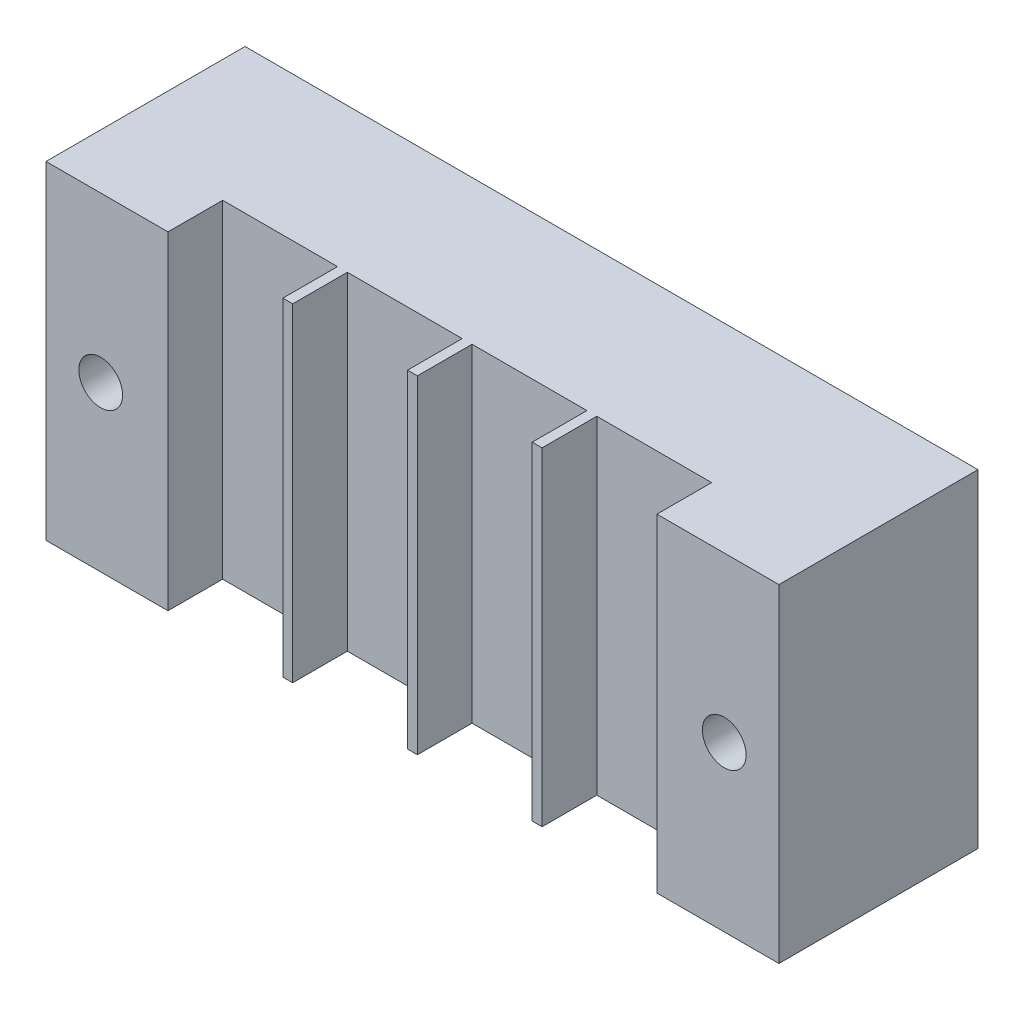
ISO-10303-21;
HEADER;
FILE_DESCRIPTION(('STEP AP214'),'2;1');
FILE_NAME('part.step','',(''),(''),'','','');
FILE_SCHEMA(('AUTOMOTIVE_DESIGN { 1 0 10303 214 1 1 1 1 }'));
ENDSEC;
DATA;
#1=APPLICATION_CONTEXT('core data for automotive mechanical design processes');
#2=APPLICATION_PROTOCOL_DEFINITION('international standard','automotive_design',2000,#1);
#3=PRODUCT_CONTEXT('',#1,'mechanical');
#4=PRODUCT('Part','Part','',(#3));
#5=PRODUCT_RELATED_PRODUCT_CATEGORY('part','',(#4));
#6=PRODUCT_DEFINITION_FORMATION('','',#4);
#7=PRODUCT_DEFINITION_CONTEXT('part definition',#1,'design');
#8=PRODUCT_DEFINITION('design','',#6,#7);
#9=PRODUCT_DEFINITION_SHAPE('','',#8);
#10=(LENGTH_UNIT() NAMED_UNIT(*) SI_UNIT(.MILLI.,.METRE.));
#11=(NAMED_UNIT(*) PLANE_ANGLE_UNIT() SI_UNIT($,.RADIAN.));
#12=(NAMED_UNIT(*) SI_UNIT($,.STERADIAN.) SOLID_ANGLE_UNIT());
#13=UNCERTAINTY_MEASURE_WITH_UNIT(LENGTH_MEASURE(1.E-05),#10,'distance_accuracy_value','');
#14=(GEOMETRIC_REPRESENTATION_CONTEXT(3) GLOBAL_UNCERTAINTY_ASSIGNED_CONTEXT((#13)) GLOBAL_UNIT_ASSIGNED_CONTEXT((#10,
#11,#12)) REPRESENTATION_CONTEXT('',''));
#15=CARTESIAN_POINT('',(0.,0.,0.));
#16=DIRECTION('',(0.,0.,1.));
#17=DIRECTION('',(1.,0.,0.));
#18=AXIS2_PLACEMENT_3D('',#15,#16,#17);
#19=CARTESIAN_POINT('',(0.,0.,18.2));
#20=DIRECTION('',(0.,0.,1.));
#21=DIRECTION('',(1.,0.,0.));
#22=AXIS2_PLACEMENT_3D('',#19,#20,#21);
#23=PLANE('',#22);
#24=DIRECTION('',(0.,1.,0.));
#25=VECTOR('',#24,1.);
#26=CARTESIAN_POINT('',(10.95,15.,18.2));
#27=LINE('',#26,#25);
#28=CARTESIAN_POINT('',(10.95,-15.,18.2));
#29=VERTEX_POINT('',#28);
#30=CARTESIAN_POINT('',(10.95,15.,18.2));
#31=VERTEX_POINT('',#30);
#32=EDGE_CURVE('E189',#29,#31,#27,.T.);
#33=ORIENTED_EDGE('',*,*,#32,.F.);
#34=DIRECTION('',(1.,0.,0.));
#35=VECTOR('',#34,1.);
#36=CARTESIAN_POINT('',(-33.5,-15.,18.2));
#37=LINE('',#36,#35);
#38=CARTESIAN_POINT('',(11.85,-15.0000000000001,18.2));
#39=VERTEX_POINT('',#38);
#40=EDGE_CURVE('E296',#29,#39,#37,.T.);
#41=ORIENTED_EDGE('',*,*,#40,.T.);
#42=DIRECTION('',(0.,-1.,0.));
#43=VECTOR('',#42,1.);
#44=CARTESIAN_POINT('',(11.85,14.9999999999999,18.2));
#45=LINE('',#44,#43);
#46=CARTESIAN_POINT('',(11.85,14.9999999999999,18.2));
#47=VERTEX_POINT('',#46);
#48=EDGE_CURVE('E221',#47,#39,#45,.T.);
#49=ORIENTED_EDGE('',*,*,#48,.F.);
#50=DIRECTION('',(-1.,0.,0.));
#51=VECTOR('',#50,1.);
#52=CARTESIAN_POINT('',(-33.5,15.,18.2));
#53=LINE('',#52,#51);
#54=EDGE_CURVE('E304',#47,#31,#53,.T.);
#55=ORIENTED_EDGE('',*,*,#54,.T.);
#56=EDGE_LOOP('',(#33,#41,#49,#55));
#57=FACE_BOUND('',#56,.T.);
#58=ADVANCED_FACE('F35',(#57),#23,.T.);
#59=DIRECTION('',(0.,1.,0.));
#60=VECTOR('',#59,1.);
#61=CARTESIAN_POINT('',(-11.85,14.9999999999999,18.2));
#62=LINE('',#61,#60);
#63=CARTESIAN_POINT('',(-11.85,-15.0000000000001,18.2));
#64=VERTEX_POINT('',#63);
#65=CARTESIAN_POINT('',(-11.85,14.9999999999999,18.2));
#66=VERTEX_POINT('',#65);
#67=EDGE_CURVE('E215',#64,#66,#62,.T.);
#68=ORIENTED_EDGE('',*,*,#67,.F.);
#69=CARTESIAN_POINT('',(-10.95,-15.,18.2));
#70=VERTEX_POINT('',#69);
#71=EDGE_CURVE('E295',#64,#70,#37,.T.);
#72=ORIENTED_EDGE('',*,*,#71,.T.);
#73=DIRECTION('',(0.,-1.,0.));
#74=VECTOR('',#73,1.);
#75=CARTESIAN_POINT('',(-10.95,15.,18.2));
#76=LINE('',#75,#74);
#77=CARTESIAN_POINT('',(-10.95,15.,18.2));
#78=VERTEX_POINT('',#77);
#79=EDGE_CURVE('E257',#78,#70,#76,.T.);
#80=ORIENTED_EDGE('',*,*,#79,.F.);
#81=EDGE_CURVE('E305',#78,#66,#53,.T.);
#82=ORIENTED_EDGE('',*,*,#81,.T.);
#83=EDGE_LOOP('',(#68,#72,#80,#82));
#84=FACE_BOUND('',#83,.T.);
#85=ADVANCED_FACE('F343',(#84),#23,.T.);
#86=DIRECTION('',(0.,1.,0.));
#87=VECTOR('',#86,1.);
#88=CARTESIAN_POINT('',(22.35,14.9999999999999,18.2));
#89=LINE('',#88,#87);
#90=CARTESIAN_POINT('',(22.35,-15.0000000000001,18.2));
#91=VERTEX_POINT('',#90);
#92=CARTESIAN_POINT('',(22.35,14.9999999999999,18.2));
#93=VERTEX_POINT('',#92);
#94=EDGE_CURVE('E232',#91,#93,#89,.T.);
#95=ORIENTED_EDGE('',*,*,#94,.F.);
#96=CARTESIAN_POINT('',(33.5,-15.,18.2));
#97=VERTEX_POINT('',#96);
#98=EDGE_CURVE('E289',#91,#97,#37,.T.);
#99=ORIENTED_EDGE('',*,*,#98,.T.);
#100=DIRECTION('',(0.,1.,0.));
#101=VECTOR('',#100,1.);
#102=CARTESIAN_POINT('',(33.5,15.,18.2));
#103=LINE('',#102,#101);
#104=CARTESIAN_POINT('',(33.5,15.,18.2));
#105=VERTEX_POINT('',#104);
#106=EDGE_CURVE('E294',#97,#105,#103,.T.);
#107=ORIENTED_EDGE('',*,*,#106,.T.);
#108=EDGE_CURVE('E300',#105,#93,#53,.T.);
#109=ORIENTED_EDGE('',*,*,#108,.T.);
#110=EDGE_LOOP('',(#95,#99,#107,#109));
#111=FACE_BOUND('',#110,.T.);
#112=CARTESIAN_POINT('',(28.5,0.,18.2));
#113=DIRECTION('',(0.,0.,1.));
#114=DIRECTION('',(-1.,0.,0.));
#115=AXIS2_PLACEMENT_3D('',#112,#113,#114);
#116=CIRCLE('',#115,2.);
#117=CARTESIAN_POINT('',(26.5,0.,18.2));
#118=VERTEX_POINT('',#117);
#119=EDGE_CURVE('E273',#118,#118,#116,.T.);
#120=ORIENTED_EDGE('',*,*,#119,.F.);
#121=EDGE_LOOP('',(#120));
#122=FACE_BOUND('',#121,.T.);
#123=ADVANCED_FACE('F348',(#111,#122),#23,.T.);
#124=DIRECTION('',(0.,-1.,0.));
#125=VECTOR('',#124,1.);
#126=CARTESIAN_POINT('',(0.449999999999999,15.,18.2));
#127=LINE('',#126,#125);
#128=CARTESIAN_POINT('',(0.449999999999999,15.,18.2));
#129=VERTEX_POINT('',#128);
#130=CARTESIAN_POINT('',(0.449999999999996,-15.,18.2));
#131=VERTEX_POINT('',#130);
#132=EDGE_CURVE('E370',#129,#131,#127,.T.);
#133=ORIENTED_EDGE('',*,*,#132,.F.);
#134=CARTESIAN_POINT('',(-0.449999999999999,15.,18.2));
#135=VERTEX_POINT('',#134);
#136=EDGE_CURVE('E194',#129,#135,#53,.T.);
#137=ORIENTED_EDGE('',*,*,#136,.T.);
#138=DIRECTION('',(0.,1.,0.));
#139=VECTOR('',#138,1.);
#140=CARTESIAN_POINT('',(-0.449999999999999,15.,18.2));
#141=LINE('',#140,#139);
#142=CARTESIAN_POINT('',(-0.449999999999996,-15.,18.2));
#143=VERTEX_POINT('',#142);
#144=EDGE_CURVE('E246',#143,#135,#141,.T.);
#145=ORIENTED_EDGE('',*,*,#144,.F.);
#146=EDGE_CURVE('E297',#143,#131,#37,.T.);
#147=ORIENTED_EDGE('',*,*,#146,.T.);
#148=EDGE_LOOP('',(#133,#137,#145,#147));
#149=FACE_BOUND('',#148,.T.);
#150=ADVANCED_FACE('F353',(#149),#23,.T.);
#151=CARTESIAN_POINT('',(-33.5,15.,18.2));
#152=DIRECTION('',(1.,0.,0.));
#153=DIRECTION('',(0.,0.,-1.));
#154=AXIS2_PLACEMENT_3D('',#151,#152,#153);
#155=PLANE('',#154);
#156=DIRECTION('',(0.,-1.,0.));
#157=VECTOR('',#156,1.);
#158=CARTESIAN_POINT('',(-33.5,15.,0.));
#159=LINE('',#158,#157);
#160=CARTESIAN_POINT('',(-33.5,15.,0.));
#161=VERTEX_POINT('',#160);
#162=CARTESIAN_POINT('',(-33.5,-15.,0.));
#163=VERTEX_POINT('',#162);
#164=EDGE_CURVE('E306',#161,#163,#159,.T.);
#165=ORIENTED_EDGE('',*,*,#164,.T.);
#166=DIRECTION('',(0.,0.,-1.));
#167=VECTOR('',#166,1.);
#168=CARTESIAN_POINT('',(-33.5,-15.,18.2));
#169=LINE('',#168,#167);
#170=CARTESIAN_POINT('',(-33.5,-15.,18.2));
#171=VERTEX_POINT('',#170);
#172=EDGE_CURVE('E11',#171,#163,#169,.T.);
#173=ORIENTED_EDGE('',*,*,#172,.F.);
#174=DIRECTION('',(0.,-1.,0.));
#175=VECTOR('',#174,1.);
#176=CARTESIAN_POINT('',(-33.5,15.,18.2));
#177=LINE('',#176,#175);
#178=CARTESIAN_POINT('',(-33.5,15.,18.2));
#179=VERTEX_POINT('',#178);
#180=EDGE_CURVE('E286',#179,#171,#177,.T.);
#181=ORIENTED_EDGE('',*,*,#180,.F.);
#182=DIRECTION('',(0.,0.,-1.));
#183=VECTOR('',#182,1.);
#184=CARTESIAN_POINT('',(-33.5,15.,18.2));
#185=LINE('',#184,#183);
#186=EDGE_CURVE('E303',#179,#161,#185,.T.);
#187=ORIENTED_EDGE('',*,*,#186,.T.);
#188=EDGE_LOOP('',(#165,#173,#181,#187));
#189=FACE_BOUND('',#188,.T.);
#190=ADVANCED_FACE('F37',(#189),#155,.F.);
#191=CARTESIAN_POINT('',(-33.5,-15.,18.2));
#192=DIRECTION('',(0.,1.,0.));
#193=DIRECTION('',(-1.,0.,0.));
#194=AXIS2_PLACEMENT_3D('',#191,#192,#193);
#195=PLANE('',#194);
#196=ORIENTED_EDGE('',*,*,#40,.F.);
#197=DIRECTION('',(0.,0.,1.));
#198=VECTOR('',#197,1.);
#199=CARTESIAN_POINT('',(10.95,-15.,13.2));
#200=LINE('',#199,#198);
#201=CARTESIAN_POINT('',(10.95,-15.,13.2));
#202=VERTEX_POINT('',#201);
#203=EDGE_CURVE('E196',#202,#29,#200,.T.);
#204=ORIENTED_EDGE('',*,*,#203,.F.);
#205=DIRECTION('',(1.,0.,0.));
#206=VECTOR('',#205,1.);
#207=CARTESIAN_POINT('',(0.449999999999996,-15.,13.2));
#208=LINE('',#207,#206);
#209=CARTESIAN_POINT('',(0.449999999999996,-15.,13.2));
#210=VERTEX_POINT('',#209);
#211=EDGE_CURVE('E182',#210,#202,#208,.T.);
#212=ORIENTED_EDGE('',*,*,#211,.F.);
#213=DIRECTION('',(0.,0.,1.));
#214=VECTOR('',#213,1.);
#215=CARTESIAN_POINT('',(0.449999999999996,-15.,13.2));
#216=LINE('',#215,#214);
#217=EDGE_CURVE('E180',#210,#131,#216,.T.);
#218=ORIENTED_EDGE('',*,*,#217,.T.);
#219=ORIENTED_EDGE('',*,*,#146,.F.);
#220=DIRECTION('',(0.,0.,1.));
#221=VECTOR('',#220,1.);
#222=CARTESIAN_POINT('',(-0.449999999999996,-15.,13.2));
#223=LINE('',#222,#221);
#224=CARTESIAN_POINT('',(-0.449999999999996,-15.,13.2));
#225=VERTEX_POINT('',#224);
#226=EDGE_CURVE('E271',#225,#143,#223,.T.);
#227=ORIENTED_EDGE('',*,*,#226,.F.);
#228=DIRECTION('',(1.,0.,0.));
#229=VECTOR('',#228,1.);
#230=CARTESIAN_POINT('',(-0.449999999999996,-15.,13.2));
#231=LINE('',#230,#229);
#232=CARTESIAN_POINT('',(-10.95,-15.,13.2));
#233=VERTEX_POINT('',#232);
#234=EDGE_CURVE('E263',#233,#225,#231,.T.);
#235=ORIENTED_EDGE('',*,*,#234,.F.);
#236=DIRECTION('',(0.,0.,1.));
#237=VECTOR('',#236,1.);
#238=CARTESIAN_POINT('',(-10.95,-15.,13.2));
#239=LINE('',#238,#237);
#240=EDGE_CURVE('E274',#233,#70,#239,.T.);
#241=ORIENTED_EDGE('',*,*,#240,.T.);
#242=ORIENTED_EDGE('',*,*,#71,.F.);
#243=DIRECTION('',(0.,0.,1.));
#244=VECTOR('',#243,1.);
#245=CARTESIAN_POINT('',(-11.85,-15.0000000000001,13.2));
#246=LINE('',#245,#244);
#247=CARTESIAN_POINT('',(-11.85,-15.0000000000001,13.2));
#248=VERTEX_POINT('',#247);
#249=EDGE_CURVE('E219',#248,#64,#246,.T.);
#250=ORIENTED_EDGE('',*,*,#249,.F.);
#251=DIRECTION('',(1.,0.,0.));
#252=VECTOR('',#251,1.);
#253=CARTESIAN_POINT('',(-11.85,-15.0000000000001,13.2));
#254=LINE('',#253,#252);
#255=CARTESIAN_POINT('',(-22.35,-15.0000000000001,13.2));
#256=VERTEX_POINT('',#255);
#257=EDGE_CURVE('E211',#256,#248,#254,.T.);
#258=ORIENTED_EDGE('',*,*,#257,.F.);
#259=DIRECTION('',(0.,0.,1.));
#260=VECTOR('',#259,1.);
#261=CARTESIAN_POINT('',(-22.35,-15.0000000000001,13.2));
#262=LINE('',#261,#260);
#263=CARTESIAN_POINT('',(-22.35,-15.0000000000001,18.2));
#264=VERTEX_POINT('',#263);
#265=EDGE_CURVE('E222',#256,#264,#262,.T.);
#266=ORIENTED_EDGE('',*,*,#265,.T.);
#267=EDGE_CURVE('E291',#171,#264,#37,.T.);
#268=ORIENTED_EDGE('',*,*,#267,.F.);
#269=ORIENTED_EDGE('',*,*,#172,.T.);
#270=DIRECTION('',(1.,0.,0.));
#271=VECTOR('',#270,1.);
#272=CARTESIAN_POINT('',(-33.5,-15.,0.));
#273=LINE('',#272,#271);
#274=CARTESIAN_POINT('',(33.5,-15.,0.));
#275=VERTEX_POINT('',#274);
#276=EDGE_CURVE('E309',#163,#275,#273,.T.);
#277=ORIENTED_EDGE('',*,*,#276,.T.);
#278=DIRECTION('',(0.,0.,-1.));
#279=VECTOR('',#278,1.);
#280=CARTESIAN_POINT('',(33.5,-15.,18.2));
#281=LINE('',#280,#279);
#282=EDGE_CURVE('E44',#97,#275,#281,.T.);
#283=ORIENTED_EDGE('',*,*,#282,.F.);
#284=ORIENTED_EDGE('',*,*,#98,.F.);
#285=DIRECTION('',(0.,0.,1.));
#286=VECTOR('',#285,1.);
#287=CARTESIAN_POINT('',(22.35,-15.0000000000001,13.2));
#288=LINE('',#287,#286);
#289=CARTESIAN_POINT('',(22.35,-15.0000000000001,13.2));
#290=VERTEX_POINT('',#289);
#291=EDGE_CURVE('E247',#290,#91,#288,.T.);
#292=ORIENTED_EDGE('',*,*,#291,.F.);
#293=DIRECTION('',(1.,0.,0.));
#294=VECTOR('',#293,1.);
#295=CARTESIAN_POINT('',(11.85,-15.0000000000001,13.2));
#296=LINE('',#295,#294);
#297=CARTESIAN_POINT('',(11.85,-15.0000000000001,13.2));
#298=VERTEX_POINT('',#297);
#299=EDGE_CURVE('E235',#298,#290,#296,.T.);
#300=ORIENTED_EDGE('',*,*,#299,.F.);
#301=DIRECTION('',(0.,0.,1.));
#302=VECTOR('',#301,1.);
#303=CARTESIAN_POINT('',(11.85,-15.0000000000001,13.2));
#304=LINE('',#303,#302);
#305=EDGE_CURVE('E249',#298,#39,#304,.T.);
#306=ORIENTED_EDGE('',*,*,#305,.T.);
#307=EDGE_LOOP('',(#196,#204,#212,#218,#219,#227,#235,#241,#242,#250,#258,#266,#268,#269,#277,
#283,#284,#292,#300,#306));
#308=FACE_BOUND('',#307,.T.);
#309=ADVANCED_FACE('F366',(#308),#195,.F.);
#310=CARTESIAN_POINT('',(33.5,15.,18.2));
#311=DIRECTION('',(-1.,0.,0.));
#312=DIRECTION('',(0.,-1.,0.));
#313=AXIS2_PLACEMENT_3D('',#310,#311,#312);
#314=PLANE('',#313);
#315=DIRECTION('',(0.,1.,0.));
#316=VECTOR('',#315,1.);
#317=CARTESIAN_POINT('',(33.5,15.,0.));
#318=LINE('',#317,#316);
#319=CARTESIAN_POINT('',(33.5,15.,0.));
#320=VERTEX_POINT('',#319);
#321=EDGE_CURVE('E311',#275,#320,#318,.T.);
#322=ORIENTED_EDGE('',*,*,#321,.T.);
#323=DIRECTION('',(0.,0.,-1.));
#324=VECTOR('',#323,1.);
#325=CARTESIAN_POINT('',(33.5,15.,18.2));
#326=LINE('',#325,#324);
#327=EDGE_CURVE('E316',#105,#320,#326,.T.);
#328=ORIENTED_EDGE('',*,*,#327,.F.);
#329=ORIENTED_EDGE('',*,*,#106,.F.);
#330=ORIENTED_EDGE('',*,*,#282,.T.);
#331=EDGE_LOOP('',(#322,#328,#329,#330));
#332=FACE_BOUND('',#331,.T.);
#333=ADVANCED_FACE('F357',(#332),#314,.F.);
#334=CARTESIAN_POINT('',(-33.5,15.,18.2));
#335=DIRECTION('',(0.,-1.,0.));
#336=DIRECTION('',(1.,0.,0.));
#337=AXIS2_PLACEMENT_3D('',#334,#335,#336);
#338=PLANE('',#337);
#339=DIRECTION('',(-1.,0.,0.));
#340=VECTOR('',#339,1.);
#341=CARTESIAN_POINT('',(0.449999999999999,15.,13.2));
#342=LINE('',#341,#340);
#343=CARTESIAN_POINT('',(10.95,15.,13.2));
#344=VERTEX_POINT('',#343);
#345=CARTESIAN_POINT('',(0.449999999999999,15.,13.2));
#346=VERTEX_POINT('',#345);
#347=EDGE_CURVE('E183',#344,#346,#342,.T.);
#348=ORIENTED_EDGE('',*,*,#347,.F.);
#349=DIRECTION('',(0.,0.,1.));
#350=VECTOR('',#349,1.);
#351=CARTESIAN_POINT('',(10.95,15.,13.2));
#352=LINE('',#351,#350);
#353=EDGE_CURVE('E217',#344,#31,#352,.T.);
#354=ORIENTED_EDGE('',*,*,#353,.T.);
#355=ORIENTED_EDGE('',*,*,#54,.F.);
#356=DIRECTION('',(0.,0.,1.));
#357=VECTOR('',#356,1.);
#358=CARTESIAN_POINT('',(11.85,14.9999999999999,13.2));
#359=LINE('',#358,#357);
#360=CARTESIAN_POINT('',(11.85,14.9999999999999,13.2));
#361=VERTEX_POINT('',#360);
#362=EDGE_CURVE('E239',#361,#47,#359,.T.);
#363=ORIENTED_EDGE('',*,*,#362,.F.);
#364=DIRECTION('',(-1.,0.,0.));
#365=VECTOR('',#364,1.);
#366=CARTESIAN_POINT('',(11.85,14.9999999999999,13.2));
#367=LINE('',#366,#365);
#368=CARTESIAN_POINT('',(22.35,15.,13.2));
#369=VERTEX_POINT('',#368);
#370=EDGE_CURVE('E228',#369,#361,#367,.T.);
#371=ORIENTED_EDGE('',*,*,#370,.F.);
#372=DIRECTION('',(0.,0.,1.));
#373=VECTOR('',#372,1.);
#374=CARTESIAN_POINT('',(22.35,14.9999999999999,13.2));
#375=LINE('',#374,#373);
#376=EDGE_CURVE('E243',#369,#93,#375,.T.);
#377=ORIENTED_EDGE('',*,*,#376,.T.);
#378=ORIENTED_EDGE('',*,*,#108,.F.);
#379=ORIENTED_EDGE('',*,*,#327,.T.);
#380=DIRECTION('',(-1.,0.,0.));
#381=VECTOR('',#380,1.);
#382=CARTESIAN_POINT('',(-33.5,15.,0.));
#383=LINE('',#382,#381);
#384=EDGE_CURVE('E290',#320,#161,#383,.T.);
#385=ORIENTED_EDGE('',*,*,#384,.T.);
#386=ORIENTED_EDGE('',*,*,#186,.F.);
#387=CARTESIAN_POINT('',(-22.35,15.,18.2));
#388=VERTEX_POINT('',#387);
#389=EDGE_CURVE('E299',#388,#179,#53,.T.);
#390=ORIENTED_EDGE('',*,*,#389,.F.);
#391=DIRECTION('',(0.,0.,1.));
#392=VECTOR('',#391,1.);
#393=CARTESIAN_POINT('',(-22.35,14.9999999999999,13.2));
#394=LINE('',#393,#392);
#395=CARTESIAN_POINT('',(-22.35,14.9999999999999,13.2));
#396=VERTEX_POINT('',#395);
#397=EDGE_CURVE('E60',#396,#388,#394,.T.);
#398=ORIENTED_EDGE('',*,*,#397,.F.);
#399=DIRECTION('',(-1.,0.,0.));
#400=VECTOR('',#399,1.);
#401=CARTESIAN_POINT('',(-11.85,14.9999999999999,13.2));
#402=LINE('',#401,#400);
#403=CARTESIAN_POINT('',(-11.85,14.9999999999999,13.2));
#404=VERTEX_POINT('',#403);
#405=EDGE_CURVE('E204',#404,#396,#402,.T.);
#406=ORIENTED_EDGE('',*,*,#405,.F.);
#407=DIRECTION('',(0.,0.,1.));
#408=VECTOR('',#407,1.);
#409=CARTESIAN_POINT('',(-11.85,14.9999999999999,13.2));
#410=LINE('',#409,#408);
#411=EDGE_CURVE('E214',#404,#66,#410,.T.);
#412=ORIENTED_EDGE('',*,*,#411,.T.);
#413=ORIENTED_EDGE('',*,*,#81,.F.);
#414=DIRECTION('',(0.,0.,1.));
#415=VECTOR('',#414,1.);
#416=CARTESIAN_POINT('',(-10.95,15.,13.2));
#417=LINE('',#416,#415);
#418=CARTESIAN_POINT('',(-10.95,15.,13.2));
#419=VERTEX_POINT('',#418);
#420=EDGE_CURVE('E277',#419,#78,#417,.T.);
#421=ORIENTED_EDGE('',*,*,#420,.F.);
#422=DIRECTION('',(-1.,0.,0.));
#423=VECTOR('',#422,1.);
#424=CARTESIAN_POINT('',(-0.449999999999999,15.,13.2));
#425=LINE('',#424,#423);
#426=CARTESIAN_POINT('',(-0.449999999999999,15.,13.2));
#427=VERTEX_POINT('',#426);
#428=EDGE_CURVE('E256',#427,#419,#425,.T.);
#429=ORIENTED_EDGE('',*,*,#428,.F.);
#430=DIRECTION('',(0.,0.,1.));
#431=VECTOR('',#430,1.);
#432=CARTESIAN_POINT('',(-0.449999999999999,15.,13.2));
#433=LINE('',#432,#431);
#434=EDGE_CURVE('E266',#427,#135,#433,.T.);
#435=ORIENTED_EDGE('',*,*,#434,.T.);
#436=ORIENTED_EDGE('',*,*,#136,.F.);
#437=DIRECTION('',(0.,0.,1.));
#438=VECTOR('',#437,1.);
#439=CARTESIAN_POINT('',(0.449999999999999,15.,13.2));
#440=LINE('',#439,#438);
#441=EDGE_CURVE('E177',#346,#129,#440,.T.);
#442=ORIENTED_EDGE('',*,*,#441,.F.);
#443=EDGE_LOOP('',(#348,#354,#355,#363,#371,#377,#378,#379,#385,#386,#390,#398,#406,#412,#413,
#421,#429,#435,#436,#442));
#444=FACE_BOUND('',#443,.T.);
#445=ADVANCED_FACE('F192',(#444),#338,.F.);
#446=DIRECTION('',(0.,-1.,0.));
#447=VECTOR('',#446,1.);
#448=CARTESIAN_POINT('',(-22.35,14.9999999999999,18.2));
#449=LINE('',#448,#447);
#450=EDGE_CURVE('E205',#388,#264,#449,.T.);
#451=ORIENTED_EDGE('',*,*,#450,.F.);
#452=ORIENTED_EDGE('',*,*,#389,.T.);
#453=ORIENTED_EDGE('',*,*,#180,.T.);
#454=ORIENTED_EDGE('',*,*,#267,.T.);
#455=EDGE_LOOP('',(#451,#452,#453,#454));
#456=FACE_BOUND('',#455,.T.);
#457=CARTESIAN_POINT('',(-28.5,0.,18.2));
#458=DIRECTION('',(0.,0.,1.));
#459=DIRECTION('',(1.,0.,0.));
#460=AXIS2_PLACEMENT_3D('',#457,#458,#459);
#461=CIRCLE('',#460,2.);
#462=CARTESIAN_POINT('',(-26.5,0.,18.2));
#463=VERTEX_POINT('',#462);
#464=EDGE_CURVE('E282',#463,#463,#461,.T.);
#465=ORIENTED_EDGE('',*,*,#464,.F.);
#466=EDGE_LOOP('',(#465));
#467=FACE_BOUND('',#466,.T.);
#468=ADVANCED_FACE('F338',(#456,#467),#23,.T.);
#469=CARTESIAN_POINT('',(0.,0.,0.));
#470=DIRECTION('',(0.,0.,1.));
#471=DIRECTION('',(1.,0.,0.));
#472=AXIS2_PLACEMENT_3D('',#469,#470,#471);
#473=PLANE('',#472);
#474=CARTESIAN_POINT('',(28.5,0.,0.));
#475=DIRECTION('',(0.,0.,1.));
#476=DIRECTION('',(1.,0.,0.));
#477=AXIS2_PLACEMENT_3D('',#474,#475,#476);
#478=CIRCLE('',#477,2.);
#479=CARTESIAN_POINT('',(30.5,0.,0.));
#480=VERTEX_POINT('',#479);
#481=EDGE_CURVE('E39',#480,#480,#478,.T.);
#482=ORIENTED_EDGE('',*,*,#481,.T.);
#483=EDGE_LOOP('',(#482));
#484=FACE_BOUND('',#483,.T.);
#485=CARTESIAN_POINT('',(-28.5,0.,0.));
#486=DIRECTION('',(0.,0.,1.));
#487=DIRECTION('',(1.,0.,0.));
#488=AXIS2_PLACEMENT_3D('',#485,#486,#487);
#489=CIRCLE('',#488,2.);
#490=CARTESIAN_POINT('',(-26.5,0.,0.));
#491=VERTEX_POINT('',#490);
#492=EDGE_CURVE('E285',#491,#491,#489,.T.);
#493=ORIENTED_EDGE('',*,*,#492,.T.);
#494=EDGE_LOOP('',(#493));
#495=FACE_BOUND('',#494,.T.);
#496=ORIENTED_EDGE('',*,*,#164,.F.);
#497=ORIENTED_EDGE('',*,*,#384,.F.);
#498=ORIENTED_EDGE('',*,*,#321,.F.);
#499=ORIENTED_EDGE('',*,*,#276,.F.);
#500=EDGE_LOOP('',(#496,#497,#498,#499));
#501=FACE_BOUND('',#500,.T.);
#502=ADVANCED_FACE('F323',(#484,#495,#501),#473,.F.);
#503=CARTESIAN_POINT('',(-28.5,0.,-0.799999999999999));
#504=DIRECTION('',(0.,0.,1.));
#505=DIRECTION('',(1.,0.,0.));
#506=AXIS2_PLACEMENT_3D('',#503,#504,#505);
#507=CYLINDRICAL_SURFACE('',#506,2.);
#508=ORIENTED_EDGE('',*,*,#464,.T.);
#509=EDGE_LOOP('',(#508));
#510=FACE_BOUND('',#509,.T.);
#511=ORIENTED_EDGE('',*,*,#492,.F.);
#512=EDGE_LOOP('',(#511));
#513=FACE_BOUND('',#512,.T.);
#514=ADVANCED_FACE('F326',(#510,#513),#507,.F.);
#515=CARTESIAN_POINT('',(28.5,0.,-0.799999999999999));
#516=DIRECTION('',(0.,0.,1.));
#517=DIRECTION('',(1.,0.,0.));
#518=AXIS2_PLACEMENT_3D('',#515,#516,#517);
#519=CYLINDRICAL_SURFACE('',#518,2.);
#520=ORIENTED_EDGE('',*,*,#119,.T.);
#521=EDGE_LOOP('',(#520));
#522=FACE_BOUND('',#521,.T.);
#523=ORIENTED_EDGE('',*,*,#481,.F.);
#524=EDGE_LOOP('',(#523));
#525=FACE_BOUND('',#524,.T.);
#526=ADVANCED_FACE('F328',(#522,#525),#519,.F.);
#527=CARTESIAN_POINT('',(-0.449999999999999,15.,13.2));
#528=DIRECTION('',(1.,0.,0.));
#529=DIRECTION('',(0.,1.,0.));
#530=AXIS2_PLACEMENT_3D('',#527,#528,#529);
#531=PLANE('',#530);
#532=ORIENTED_EDGE('',*,*,#144,.T.);
#533=ORIENTED_EDGE('',*,*,#434,.F.);
#534=DIRECTION('',(0.,1.,0.));
#535=VECTOR('',#534,1.);
#536=CARTESIAN_POINT('',(-0.449999999999999,15.,13.2));
#537=LINE('',#536,#535);
#538=EDGE_CURVE('E253',#225,#427,#537,.T.);
#539=ORIENTED_EDGE('',*,*,#538,.F.);
#540=ORIENTED_EDGE('',*,*,#226,.T.);
#541=EDGE_LOOP('',(#532,#533,#539,#540));
#542=FACE_BOUND('',#541,.T.);
#543=ADVANCED_FACE('F335',(#542),#531,.F.);
#544=CARTESIAN_POINT('',(-10.95,15.,13.2));
#545=DIRECTION('',(-1.,0.,0.));
#546=DIRECTION('',(0.,-1.,0.));
#547=AXIS2_PLACEMENT_3D('',#544,#545,#546);
#548=PLANE('',#547);
#549=ORIENTED_EDGE('',*,*,#79,.T.);
#550=ORIENTED_EDGE('',*,*,#240,.F.);
#551=DIRECTION('',(0.,-1.,0.));
#552=VECTOR('',#551,1.);
#553=CARTESIAN_POINT('',(-10.95,15.,13.2));
#554=LINE('',#553,#552);
#555=EDGE_CURVE('E260',#419,#233,#554,.T.);
#556=ORIENTED_EDGE('',*,*,#555,.F.);
#557=ORIENTED_EDGE('',*,*,#420,.T.);
#558=EDGE_LOOP('',(#549,#550,#556,#557));
#559=FACE_BOUND('',#558,.T.);
#560=ADVANCED_FACE('F393',(#559),#548,.F.);
#561=CARTESIAN_POINT('',(0.,0.,13.2));
#562=DIRECTION('',(0.,0.,-1.));
#563=DIRECTION('',(-1.,0.,0.));
#564=AXIS2_PLACEMENT_3D('',#561,#562,#563);
#565=PLANE('',#564);
#566=ORIENTED_EDGE('',*,*,#538,.T.);
#567=ORIENTED_EDGE('',*,*,#428,.T.);
#568=ORIENTED_EDGE('',*,*,#555,.T.);
#569=ORIENTED_EDGE('',*,*,#234,.T.);
#570=EDGE_LOOP('',(#566,#567,#568,#569));
#571=FACE_BOUND('',#570,.T.);
#572=ADVANCED_FACE('F398',(#571),#565,.F.);
#573=CARTESIAN_POINT('',(22.35,14.9999999999999,13.2));
#574=DIRECTION('',(1.,0.,0.));
#575=DIRECTION('',(0.,1.,0.));
#576=AXIS2_PLACEMENT_3D('',#573,#574,#575);
#577=PLANE('',#576);
#578=ORIENTED_EDGE('',*,*,#94,.T.);
#579=ORIENTED_EDGE('',*,*,#376,.F.);
#580=DIRECTION('',(0.,1.,0.));
#581=VECTOR('',#580,1.);
#582=CARTESIAN_POINT('',(22.35,14.9999999999999,13.2));
#583=LINE('',#582,#581);
#584=EDGE_CURVE('E237',#290,#369,#583,.T.);
#585=ORIENTED_EDGE('',*,*,#584,.F.);
#586=ORIENTED_EDGE('',*,*,#291,.T.);
#587=EDGE_LOOP('',(#578,#579,#585,#586));
#588=FACE_BOUND('',#587,.T.);
#589=ADVANCED_FACE('F427',(#588),#577,.F.);
#590=CARTESIAN_POINT('',(11.85,14.9999999999999,13.2));
#591=DIRECTION('',(-1.,0.,0.));
#592=DIRECTION('',(0.,-1.,0.));
#593=AXIS2_PLACEMENT_3D('',#590,#591,#592);
#594=PLANE('',#593);
#595=ORIENTED_EDGE('',*,*,#48,.T.);
#596=ORIENTED_EDGE('',*,*,#305,.F.);
#597=DIRECTION('',(0.,-1.,0.));
#598=VECTOR('',#597,1.);
#599=CARTESIAN_POINT('',(11.85,14.9999999999999,13.2));
#600=LINE('',#599,#598);
#601=EDGE_CURVE('E231',#361,#298,#600,.T.);
#602=ORIENTED_EDGE('',*,*,#601,.F.);
#603=ORIENTED_EDGE('',*,*,#362,.T.);
#604=EDGE_LOOP('',(#595,#596,#602,#603));
#605=FACE_BOUND('',#604,.T.);
#606=ADVANCED_FACE('F422',(#605),#594,.F.);
#607=CARTESIAN_POINT('',(0.,0.,13.2));
#608=DIRECTION('',(0.,0.,-1.));
#609=DIRECTION('',(-1.,0.,0.));
#610=AXIS2_PLACEMENT_3D('',#607,#608,#609);
#611=PLANE('',#610);
#612=ORIENTED_EDGE('',*,*,#370,.T.);
#613=ORIENTED_EDGE('',*,*,#601,.T.);
#614=ORIENTED_EDGE('',*,*,#299,.T.);
#615=ORIENTED_EDGE('',*,*,#584,.T.);
#616=EDGE_LOOP('',(#612,#613,#614,#615));
#617=FACE_BOUND('',#616,.T.);
#618=ADVANCED_FACE('F415',(#617),#611,.F.);
#619=CARTESIAN_POINT('',(-11.85,14.9999999999999,13.2));
#620=DIRECTION('',(1.,0.,0.));
#621=DIRECTION('',(0.,1.,0.));
#622=AXIS2_PLACEMENT_3D('',#619,#620,#621);
#623=PLANE('',#622);
#624=ORIENTED_EDGE('',*,*,#67,.T.);
#625=ORIENTED_EDGE('',*,*,#411,.F.);
#626=DIRECTION('',(0.,1.,0.));
#627=VECTOR('',#626,1.);
#628=CARTESIAN_POINT('',(-11.85,14.9999999999999,13.2));
#629=LINE('',#628,#627);
#630=EDGE_CURVE('E201',#248,#404,#629,.T.);
#631=ORIENTED_EDGE('',*,*,#630,.F.);
#632=ORIENTED_EDGE('',*,*,#249,.T.);
#633=EDGE_LOOP('',(#624,#625,#631,#632));
#634=FACE_BOUND('',#633,.T.);
#635=ADVANCED_FACE('F413',(#634),#623,.F.);
#636=CARTESIAN_POINT('',(-22.35,14.9999999999999,13.2));
#637=DIRECTION('',(-1.,0.,0.));
#638=DIRECTION('',(0.,-1.,0.));
#639=AXIS2_PLACEMENT_3D('',#636,#637,#638);
#640=PLANE('',#639);
#641=ORIENTED_EDGE('',*,*,#450,.T.);
#642=ORIENTED_EDGE('',*,*,#265,.F.);
#643=DIRECTION('',(0.,-1.,0.));
#644=VECTOR('',#643,1.);
#645=CARTESIAN_POINT('',(-22.35,14.9999999999999,13.2));
#646=LINE('',#645,#644);
#647=EDGE_CURVE('E208',#396,#256,#646,.T.);
#648=ORIENTED_EDGE('',*,*,#647,.F.);
#649=ORIENTED_EDGE('',*,*,#397,.T.);
#650=EDGE_LOOP('',(#641,#642,#648,#649));
#651=FACE_BOUND('',#650,.T.);
#652=ADVANCED_FACE('F409',(#651),#640,.F.);
#653=CARTESIAN_POINT('',(0.,0.,13.2));
#654=DIRECTION('',(0.,0.,-1.));
#655=DIRECTION('',(-1.,0.,0.));
#656=AXIS2_PLACEMENT_3D('',#653,#654,#655);
#657=PLANE('',#656);
#658=ORIENTED_EDGE('',*,*,#630,.T.);
#659=ORIENTED_EDGE('',*,*,#405,.T.);
#660=ORIENTED_EDGE('',*,*,#647,.T.);
#661=ORIENTED_EDGE('',*,*,#257,.T.);
#662=EDGE_LOOP('',(#658,#659,#660,#661));
#663=FACE_BOUND('',#662,.T.);
#664=ADVANCED_FACE('F411',(#663),#657,.F.);
#665=CARTESIAN_POINT('',(10.95,15.,13.2));
#666=DIRECTION('',(1.,0.,0.));
#667=DIRECTION('',(0.,1.,0.));
#668=AXIS2_PLACEMENT_3D('',#665,#666,#667);
#669=PLANE('',#668);
#670=ORIENTED_EDGE('',*,*,#32,.T.);
#671=ORIENTED_EDGE('',*,*,#353,.F.);
#672=DIRECTION('',(0.,1.,0.));
#673=VECTOR('',#672,1.);
#674=CARTESIAN_POINT('',(10.95,15.,13.2));
#675=LINE('',#674,#673);
#676=EDGE_CURVE('E52',#202,#344,#675,.T.);
#677=ORIENTED_EDGE('',*,*,#676,.F.);
#678=ORIENTED_EDGE('',*,*,#203,.T.);
#679=EDGE_LOOP('',(#670,#671,#677,#678));
#680=FACE_BOUND('',#679,.T.);
#681=ADVANCED_FACE('F379',(#680),#669,.F.);
#682=CARTESIAN_POINT('',(0.449999999999999,15.,13.2));
#683=DIRECTION('',(-1.,0.,0.));
#684=DIRECTION('',(0.,-1.,0.));
#685=AXIS2_PLACEMENT_3D('',#682,#683,#684);
#686=PLANE('',#685);
#687=ORIENTED_EDGE('',*,*,#132,.T.);
#688=ORIENTED_EDGE('',*,*,#217,.F.);
#689=DIRECTION('',(0.,-1.,0.));
#690=VECTOR('',#689,1.);
#691=CARTESIAN_POINT('',(0.449999999999999,15.,13.2));
#692=LINE('',#691,#690);
#693=EDGE_CURVE('E174',#346,#210,#692,.T.);
#694=ORIENTED_EDGE('',*,*,#693,.F.);
#695=ORIENTED_EDGE('',*,*,#441,.T.);
#696=EDGE_LOOP('',(#687,#688,#694,#695));
#697=FACE_BOUND('',#696,.T.);
#698=ADVANCED_FACE('F175',(#697),#686,.F.);
#699=CARTESIAN_POINT('',(0.,0.,13.2));
#700=DIRECTION('',(0.,0.,-1.));
#701=DIRECTION('',(-1.,0.,0.));
#702=AXIS2_PLACEMENT_3D('',#699,#700,#701);
#703=PLANE('',#702);
#704=ORIENTED_EDGE('',*,*,#347,.T.);
#705=ORIENTED_EDGE('',*,*,#693,.T.);
#706=ORIENTED_EDGE('',*,*,#211,.T.);
#707=ORIENTED_EDGE('',*,*,#676,.T.);
#708=EDGE_LOOP('',(#704,#705,#706,#707));
#709=FACE_BOUND('',#708,.T.);
#710=ADVANCED_FACE('F186',(#709),#703,.F.);
#711=CLOSED_SHELL('',(#58,#85,#123,#150,#190,#309,#333,#445,#468,#502,#514,#526,#543,#560,#572,
#589,#606,#618,#635,#652,#664,#681,#698,#710));
#712=MANIFOLD_SOLID_BREP('B2',#711);
#713=ADVANCED_BREP_SHAPE_REPRESENTATION('',(#18,#712),#14);
#714=SHAPE_DEFINITION_REPRESENTATION(#9,#713);
ENDSEC;
END-ISO-10303-21;
